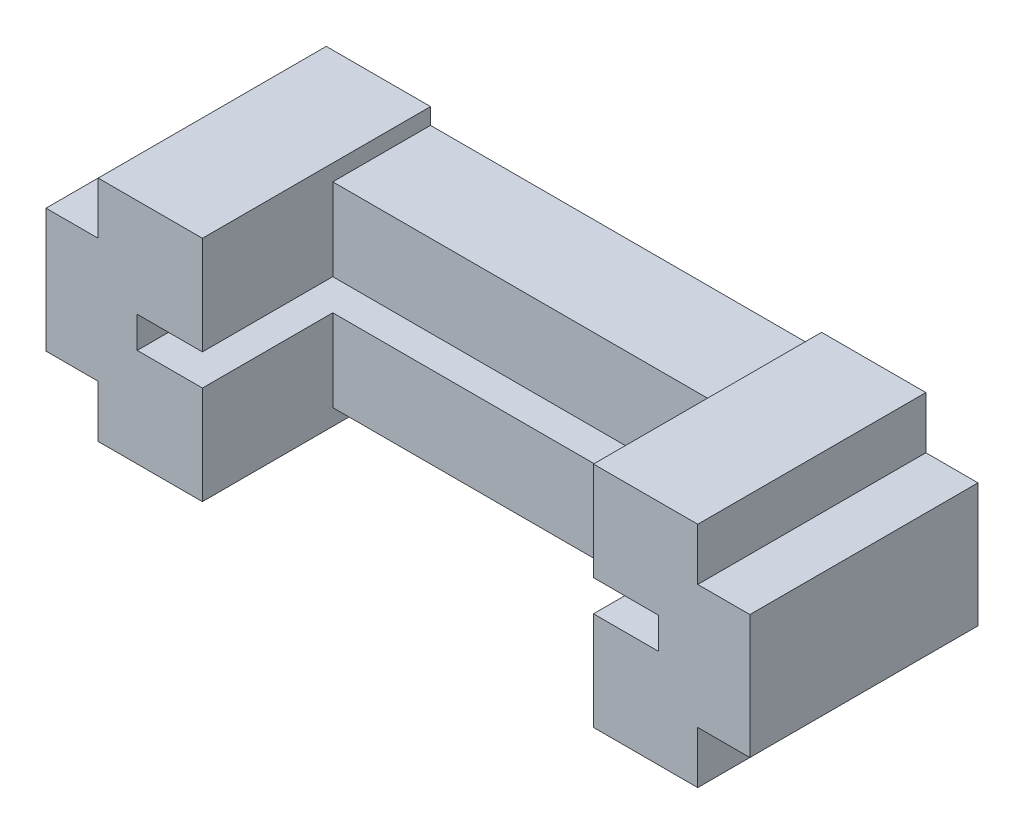
ISO-10303-21;
HEADER;
FILE_DESCRIPTION(('STEP AP214'),'2;1');
FILE_NAME('part.step','',(''),(''),'','','');
FILE_SCHEMA(('AUTOMOTIVE_DESIGN { 1 0 10303 214 1 1 1 1 }'));
ENDSEC;
DATA;
#1=APPLICATION_CONTEXT('core data for automotive mechanical design processes');
#2=APPLICATION_PROTOCOL_DEFINITION('international standard','automotive_design',2000,#1);
#3=PRODUCT_CONTEXT('',#1,'mechanical');
#4=PRODUCT('Part','Part','',(#3));
#5=PRODUCT_RELATED_PRODUCT_CATEGORY('part','',(#4));
#6=PRODUCT_DEFINITION_FORMATION('','',#4);
#7=PRODUCT_DEFINITION_CONTEXT('part definition',#1,'design');
#8=PRODUCT_DEFINITION('design','',#6,#7);
#9=PRODUCT_DEFINITION_SHAPE('','',#8);
#10=(LENGTH_UNIT() NAMED_UNIT(*) SI_UNIT(.MILLI.,.METRE.));
#11=(NAMED_UNIT(*) PLANE_ANGLE_UNIT() SI_UNIT($,.RADIAN.));
#12=(NAMED_UNIT(*) SI_UNIT($,.STERADIAN.) SOLID_ANGLE_UNIT());
#13=UNCERTAINTY_MEASURE_WITH_UNIT(LENGTH_MEASURE(1.E-05),#10,'distance_accuracy_value','');
#14=(GEOMETRIC_REPRESENTATION_CONTEXT(3) GLOBAL_UNCERTAINTY_ASSIGNED_CONTEXT((#13)) GLOBAL_UNIT_ASSIGNED_CONTEXT((#10,
#11,#12)) REPRESENTATION_CONTEXT('',''));
#15=CARTESIAN_POINT('',(0.,0.,0.));
#16=DIRECTION('',(0.,0.,1.));
#17=DIRECTION('',(1.,0.,0.));
#18=AXIS2_PLACEMENT_3D('',#15,#16,#17);
#19=CARTESIAN_POINT('',(-29.21,-11.1125,9.525));
#20=DIRECTION('',(0.,1.,0.));
#21=DIRECTION('',(-1.,0.,0.));
#22=AXIS2_PLACEMENT_3D('',#19,#20,#21);
#23=PLANE('',#22);
#24=DIRECTION('',(1.,0.,0.));
#25=VECTOR('',#24,1.);
#26=CARTESIAN_POINT('',(-29.21,-11.1125,0.));
#27=LINE('',#26,#25);
#28=CARTESIAN_POINT('',(-29.21,-11.1125,0.));
#29=VERTEX_POINT('',#28);
#30=CARTESIAN_POINT('',(-19.05,-11.1125,0.));
#31=VERTEX_POINT('',#30);
#32=EDGE_CURVE('E387',#29,#31,#27,.T.);
#33=ORIENTED_EDGE('',*,*,#32,.T.);
#34=DIRECTION('',(0.,0.,-1.));
#35=VECTOR('',#34,1.);
#36=CARTESIAN_POINT('',(-19.05,-11.1125,22.225));
#37=LINE('',#36,#35);
#38=CARTESIAN_POINT('',(-19.05,-11.1125,22.225));
#39=VERTEX_POINT('',#38);
#40=EDGE_CURVE('E360',#39,#31,#37,.T.);
#41=ORIENTED_EDGE('',*,*,#40,.F.);
#42=DIRECTION('',(1.,0.,0.));
#43=VECTOR('',#42,1.);
#44=CARTESIAN_POINT('',(-29.21,-11.1125,22.225));
#45=LINE('',#44,#43);
#46=CARTESIAN_POINT('',(-29.21,-11.1125,22.225));
#47=VERTEX_POINT('',#46);
#48=EDGE_CURVE('E358',#47,#39,#45,.T.);
#49=ORIENTED_EDGE('',*,*,#48,.F.);
#50=DIRECTION('',(0.,0.,-1.));
#51=VECTOR('',#50,1.);
#52=CARTESIAN_POINT('',(-29.21,-11.1125,9.525));
#53=LINE('',#52,#51);
#54=EDGE_CURVE('E424',#47,#29,#53,.T.);
#55=ORIENTED_EDGE('',*,*,#54,.T.);
#56=EDGE_LOOP('',(#33,#41,#49,#55));
#57=FACE_BOUND('',#56,.T.);
#58=ADVANCED_FACE('F35',(#57),#23,.F.);
#59=CARTESIAN_POINT('',(-29.21,11.1125,9.525));
#60=DIRECTION('',(0.,-1.,0.));
#61=DIRECTION('',(1.,0.,0.));
#62=AXIS2_PLACEMENT_3D('',#59,#60,#61);
#63=PLANE('',#62);
#64=DIRECTION('',(0.,0.,-1.));
#65=VECTOR('',#64,1.);
#66=CARTESIAN_POINT('',(-19.05,11.1125,22.225));
#67=LINE('',#66,#65);
#68=CARTESIAN_POINT('',(-19.05,11.1125,22.225));
#69=VERTEX_POINT('',#68);
#70=CARTESIAN_POINT('',(-19.05,11.1125,0.));
#71=VERTEX_POINT('',#70);
#72=EDGE_CURVE('E364',#69,#71,#67,.T.);
#73=ORIENTED_EDGE('',*,*,#72,.T.);
#74=DIRECTION('',(-1.,0.,0.));
#75=VECTOR('',#74,1.);
#76=CARTESIAN_POINT('',(-29.21,11.1125,0.));
#77=LINE('',#76,#75);
#78=CARTESIAN_POINT('',(-29.21,11.1125,0.));
#79=VERTEX_POINT('',#78);
#80=EDGE_CURVE('E242',#71,#79,#77,.T.);
#81=ORIENTED_EDGE('',*,*,#80,.T.);
#82=DIRECTION('',(0.,0.,-1.));
#83=VECTOR('',#82,1.);
#84=CARTESIAN_POINT('',(-29.21,11.1125,9.525));
#85=LINE('',#84,#83);
#86=CARTESIAN_POINT('',(-29.21,11.1125,22.225));
#87=VERTEX_POINT('',#86);
#88=EDGE_CURVE('E403',#87,#79,#85,.T.);
#89=ORIENTED_EDGE('',*,*,#88,.F.);
#90=DIRECTION('',(-1.,0.,0.));
#91=VECTOR('',#90,1.);
#92=CARTESIAN_POINT('',(-29.21,11.1125,22.225));
#93=LINE('',#92,#91);
#94=EDGE_CURVE('E340',#69,#87,#93,.T.);
#95=ORIENTED_EDGE('',*,*,#94,.F.);
#96=EDGE_LOOP('',(#73,#81,#89,#95));
#97=FACE_BOUND('',#96,.T.);
#98=ADVANCED_FACE('F476',(#97),#63,.F.);
#99=CARTESIAN_POINT('',(0.,0.,9.525));
#100=DIRECTION('',(0.,0.,1.));
#101=DIRECTION('',(1.,0.,0.));
#102=AXIS2_PLACEMENT_3D('',#99,#100,#101);
#103=PLANE('',#102);
#104=DIRECTION('',(1.,0.,0.));
#105=VECTOR('',#104,1.);
#106=CARTESIAN_POINT('',(0.,9.525,9.525));
#107=LINE('',#106,#105);
#108=CARTESIAN_POINT('',(-19.05,9.525,9.525));
#109=VERTEX_POINT('',#108);
#110=CARTESIAN_POINT('',(19.05,9.525,9.525));
#111=VERTEX_POINT('',#110);
#112=EDGE_CURVE('E250',#109,#111,#107,.T.);
#113=ORIENTED_EDGE('',*,*,#112,.F.);
#114=DIRECTION('',(0.,1.,0.));
#115=VECTOR('',#114,1.);
#116=CARTESIAN_POINT('',(-19.05,11.1125,9.525));
#117=LINE('',#116,#115);
#118=CARTESIAN_POINT('',(-19.05,1.524,9.525));
#119=VERTEX_POINT('',#118);
#120=EDGE_CURVE('E230',#119,#109,#117,.T.);
#121=ORIENTED_EDGE('',*,*,#120,.F.);
#122=DIRECTION('',(-1.,0.,0.));
#123=VECTOR('',#122,1.);
#124=CARTESIAN_POINT('',(-25.4,1.524,9.525));
#125=LINE('',#124,#123);
#126=CARTESIAN_POINT('',(19.05,1.524,9.525));
#127=VERTEX_POINT('',#126);
#128=EDGE_CURVE('E268',#127,#119,#125,.T.);
#129=ORIENTED_EDGE('',*,*,#128,.F.);
#130=DIRECTION('',(0.,-1.,0.));
#131=VECTOR('',#130,1.);
#132=CARTESIAN_POINT('',(19.05,11.1125,9.525));
#133=LINE('',#132,#131);
#134=EDGE_CURVE('E284',#111,#127,#133,.T.);
#135=ORIENTED_EDGE('',*,*,#134,.F.);
#136=EDGE_LOOP('',(#113,#121,#129,#135));
#137=FACE_BOUND('',#136,.T.);
#138=ADVANCED_FACE('F493',(#137),#103,.T.);
#139=DIRECTION('',(-1.,0.,0.));
#140=VECTOR('',#139,1.);
#141=CARTESIAN_POINT('',(0.,-9.525,9.525));
#142=LINE('',#141,#140);
#143=CARTESIAN_POINT('',(19.05,-9.525,9.525));
#144=VERTEX_POINT('',#143);
#145=CARTESIAN_POINT('',(-19.05,-9.525,9.525));
#146=VERTEX_POINT('',#145);
#147=EDGE_CURVE('E261',#144,#146,#142,.T.);
#148=ORIENTED_EDGE('',*,*,#147,.F.);
#149=DIRECTION('',(0.,-1.,0.));
#150=VECTOR('',#149,1.);
#151=CARTESIAN_POINT('',(19.05,-1.524,9.525));
#152=LINE('',#151,#150);
#153=CARTESIAN_POINT('',(19.05,-1.524,9.525));
#154=VERTEX_POINT('',#153);
#155=EDGE_CURVE('E277',#154,#144,#152,.T.);
#156=ORIENTED_EDGE('',*,*,#155,.F.);
#157=DIRECTION('',(1.,0.,0.));
#158=VECTOR('',#157,1.);
#159=CARTESIAN_POINT('',(-25.4,-1.524,9.525));
#160=LINE('',#159,#158);
#161=CARTESIAN_POINT('',(-19.05,-1.524,9.525));
#162=VERTEX_POINT('',#161);
#163=EDGE_CURVE('E263',#162,#154,#160,.T.);
#164=ORIENTED_EDGE('',*,*,#163,.F.);
#165=DIRECTION('',(0.,1.,0.));
#166=VECTOR('',#165,1.);
#167=CARTESIAN_POINT('',(-19.05,-1.524,9.525));
#168=LINE('',#167,#166);
#169=EDGE_CURVE('E329',#146,#162,#168,.T.);
#170=ORIENTED_EDGE('',*,*,#169,.F.);
#171=EDGE_LOOP('',(#148,#156,#164,#170));
#172=FACE_BOUND('',#171,.T.);
#173=ADVANCED_FACE('F486',(#172),#103,.T.);
#174=CARTESIAN_POINT('',(-29.21,11.1125,9.525));
#175=DIRECTION('',(1.,0.,0.));
#176=DIRECTION('',(0.,0.,-1.));
#177=AXIS2_PLACEMENT_3D('',#174,#175,#176);
#178=PLANE('',#177);
#179=DIRECTION('',(0.,-1.,0.));
#180=VECTOR('',#179,1.);
#181=CARTESIAN_POINT('',(-29.21,11.1125,0.));
#182=LINE('',#181,#180);
#183=CARTESIAN_POINT('',(-29.21,6.0325,0.));
#184=VERTEX_POINT('',#183);
#185=EDGE_CURVE('E375',#79,#184,#182,.T.);
#186=ORIENTED_EDGE('',*,*,#185,.T.);
#187=DIRECTION('',(0.,0.,-1.));
#188=VECTOR('',#187,1.);
#189=CARTESIAN_POINT('',(-29.21,6.0325,9.525));
#190=LINE('',#189,#188);
#191=CARTESIAN_POINT('',(-29.21,6.0325,22.225));
#192=VERTEX_POINT('',#191);
#193=EDGE_CURVE('E11',#192,#184,#190,.T.);
#194=ORIENTED_EDGE('',*,*,#193,.F.);
#195=DIRECTION('',(0.,-1.,0.));
#196=VECTOR('',#195,1.);
#197=CARTESIAN_POINT('',(-29.21,11.1125,22.225));
#198=LINE('',#197,#196);
#199=EDGE_CURVE('E343',#87,#192,#198,.T.);
#200=ORIENTED_EDGE('',*,*,#199,.F.);
#201=ORIENTED_EDGE('',*,*,#88,.T.);
#202=EDGE_LOOP('',(#186,#194,#200,#201));
#203=FACE_BOUND('',#202,.T.);
#204=ADVANCED_FACE('F37',(#203),#178,.F.);
#205=CARTESIAN_POINT('',(-34.29,6.0325,9.525));
#206=DIRECTION('',(0.,-1.,0.));
#207=DIRECTION('',(0.,0.,-1.));
#208=AXIS2_PLACEMENT_3D('',#205,#206,#207);
#209=PLANE('',#208);
#210=DIRECTION('',(-1.,0.,0.));
#211=VECTOR('',#210,1.);
#212=CARTESIAN_POINT('',(-34.29,6.0325,0.));
#213=LINE('',#212,#211);
#214=CARTESIAN_POINT('',(-34.29,6.0325,0.));
#215=VERTEX_POINT('',#214);
#216=EDGE_CURVE('E378',#184,#215,#213,.T.);
#217=ORIENTED_EDGE('',*,*,#216,.T.);
#218=DIRECTION('',(0.,0.,-1.));
#219=VECTOR('',#218,1.);
#220=CARTESIAN_POINT('',(-34.29,6.0325,9.525));
#221=LINE('',#220,#219);
#222=CARTESIAN_POINT('',(-34.29,6.0325,22.225));
#223=VERTEX_POINT('',#222);
#224=EDGE_CURVE('E43',#223,#215,#221,.T.);
#225=ORIENTED_EDGE('',*,*,#224,.F.);
#226=DIRECTION('',(-1.,0.,0.));
#227=VECTOR('',#226,1.);
#228=CARTESIAN_POINT('',(-34.29,6.0325,22.225));
#229=LINE('',#228,#227);
#230=EDGE_CURVE('E346',#192,#223,#229,.T.);
#231=ORIENTED_EDGE('',*,*,#230,.F.);
#232=ORIENTED_EDGE('',*,*,#193,.T.);
#233=EDGE_LOOP('',(#217,#225,#231,#232));
#234=FACE_BOUND('',#233,.T.);
#235=ADVANCED_FACE('F479',(#234),#209,.F.);
#236=CARTESIAN_POINT('',(-34.29,-6.0325,9.525));
#237=DIRECTION('',(1.,0.,0.));
#238=DIRECTION('',(0.,1.,0.));
#239=AXIS2_PLACEMENT_3D('',#236,#237,#238);
#240=PLANE('',#239);
#241=DIRECTION('',(0.,-1.,0.));
#242=VECTOR('',#241,1.);
#243=CARTESIAN_POINT('',(-34.29,-6.0325,0.));
#244=LINE('',#243,#242);
#245=CARTESIAN_POINT('',(-34.29,-6.0325,0.));
#246=VERTEX_POINT('',#245);
#247=EDGE_CURVE('E380',#215,#246,#244,.T.);
#248=ORIENTED_EDGE('',*,*,#247,.T.);
#249=DIRECTION('',(0.,0.,-1.));
#250=VECTOR('',#249,1.);
#251=CARTESIAN_POINT('',(-34.29,-6.0325,9.525));
#252=LINE('',#251,#250);
#253=CARTESIAN_POINT('',(-34.29,-6.0325,22.225));
#254=VERTEX_POINT('',#253);
#255=EDGE_CURVE('E430',#254,#246,#252,.T.);
#256=ORIENTED_EDGE('',*,*,#255,.F.);
#257=DIRECTION('',(0.,-1.,0.));
#258=VECTOR('',#257,1.);
#259=CARTESIAN_POINT('',(-34.29,6.0325,22.225));
#260=LINE('',#259,#258);
#261=EDGE_CURVE('E349',#223,#254,#260,.T.);
#262=ORIENTED_EDGE('',*,*,#261,.F.);
#263=ORIENTED_EDGE('',*,*,#224,.T.);
#264=EDGE_LOOP('',(#248,#256,#262,#263));
#265=FACE_BOUND('',#264,.T.);
#266=ADVANCED_FACE('F436',(#265),#240,.F.);
#267=CARTESIAN_POINT('',(-34.29,-6.0325,9.525));
#268=DIRECTION('',(0.,1.,0.));
#269=DIRECTION('',(0.,0.,1.));
#270=AXIS2_PLACEMENT_3D('',#267,#268,#269);
#271=PLANE('',#270);
#272=DIRECTION('',(1.,0.,0.));
#273=VECTOR('',#272,1.);
#274=CARTESIAN_POINT('',(-34.29,-6.0325,0.));
#275=LINE('',#274,#273);
#276=CARTESIAN_POINT('',(-29.21,-6.0325,0.));
#277=VERTEX_POINT('',#276);
#278=EDGE_CURVE('E382',#246,#277,#275,.T.);
#279=ORIENTED_EDGE('',*,*,#278,.T.);
#280=DIRECTION('',(0.,0.,-1.));
#281=VECTOR('',#280,1.);
#282=CARTESIAN_POINT('',(-29.21,-6.0325,9.525));
#283=LINE('',#282,#281);
#284=CARTESIAN_POINT('',(-29.21,-6.0325,22.225));
#285=VERTEX_POINT('',#284);
#286=EDGE_CURVE('E427',#285,#277,#283,.T.);
#287=ORIENTED_EDGE('',*,*,#286,.F.);
#288=DIRECTION('',(1.,0.,0.));
#289=VECTOR('',#288,1.);
#290=CARTESIAN_POINT('',(-29.21,-6.0325,22.225));
#291=LINE('',#290,#289);
#292=EDGE_CURVE('E352',#254,#285,#291,.T.);
#293=ORIENTED_EDGE('',*,*,#292,.F.);
#294=ORIENTED_EDGE('',*,*,#255,.T.);
#295=EDGE_LOOP('',(#279,#287,#293,#294));
#296=FACE_BOUND('',#295,.T.);
#297=ADVANCED_FACE('F443',(#296),#271,.F.);
#298=CARTESIAN_POINT('',(-29.21,-11.1125,9.525));
#299=DIRECTION('',(1.,0.,0.));
#300=DIRECTION('',(0.,0.,-1.));
#301=AXIS2_PLACEMENT_3D('',#298,#299,#300);
#302=PLANE('',#301);
#303=DIRECTION('',(0.,-1.,0.));
#304=VECTOR('',#303,1.);
#305=CARTESIAN_POINT('',(-29.21,-11.1125,0.));
#306=LINE('',#305,#304);
#307=EDGE_CURVE('E384',#277,#29,#306,.T.);
#308=ORIENTED_EDGE('',*,*,#307,.T.);
#309=ORIENTED_EDGE('',*,*,#54,.F.);
#310=DIRECTION('',(0.,-1.,0.));
#311=VECTOR('',#310,1.);
#312=CARTESIAN_POINT('',(-29.21,-6.0325,22.225));
#313=LINE('',#312,#311);
#314=EDGE_CURVE('E355',#285,#47,#313,.T.);
#315=ORIENTED_EDGE('',*,*,#314,.F.);
#316=ORIENTED_EDGE('',*,*,#286,.T.);
#317=EDGE_LOOP('',(#308,#309,#315,#316));
#318=FACE_BOUND('',#317,.T.);
#319=ADVANCED_FACE('F447',(#318),#302,.F.);
#320=DIRECTION('',(0.,0.,-1.));
#321=VECTOR('',#320,1.);
#322=CARTESIAN_POINT('',(19.05,-11.1125,22.225));
#323=LINE('',#322,#321);
#324=CARTESIAN_POINT('',(19.05,-11.1125,22.225));
#325=VERTEX_POINT('',#324);
#326=CARTESIAN_POINT('',(19.05,-11.1125,0.));
#327=VERTEX_POINT('',#326);
#328=EDGE_CURVE('E324',#325,#327,#323,.T.);
#329=ORIENTED_EDGE('',*,*,#328,.T.);
#330=CARTESIAN_POINT('',(29.21,-11.1125,0.));
#331=VERTEX_POINT('',#330);
#332=EDGE_CURVE('E386',#327,#331,#27,.T.);
#333=ORIENTED_EDGE('',*,*,#332,.T.);
#334=DIRECTION('',(0.,0.,-1.));
#335=VECTOR('',#334,1.);
#336=CARTESIAN_POINT('',(29.21,-11.1125,9.525));
#337=LINE('',#336,#335);
#338=CARTESIAN_POINT('',(29.21,-11.1125,22.225));
#339=VERTEX_POINT('',#338);
#340=EDGE_CURVE('E421',#339,#331,#337,.T.);
#341=ORIENTED_EDGE('',*,*,#340,.F.);
#342=DIRECTION('',(1.,0.,0.));
#343=VECTOR('',#342,1.);
#344=CARTESIAN_POINT('',(29.21,-11.1125,22.225));
#345=LINE('',#344,#343);
#346=EDGE_CURVE('E286',#325,#339,#345,.T.);
#347=ORIENTED_EDGE('',*,*,#346,.F.);
#348=EDGE_LOOP('',(#329,#333,#341,#347));
#349=FACE_BOUND('',#348,.T.);
#350=ADVANCED_FACE('F489',(#349),#23,.F.);
#351=CARTESIAN_POINT('',(29.21,-11.1125,9.525));
#352=DIRECTION('',(-1.,0.,0.));
#353=DIRECTION('',(0.,0.,1.));
#354=AXIS2_PLACEMENT_3D('',#351,#352,#353);
#355=PLANE('',#354);
#356=DIRECTION('',(0.,1.,0.));
#357=VECTOR('',#356,1.);
#358=CARTESIAN_POINT('',(29.21,-11.1125,0.));
#359=LINE('',#358,#357);
#360=CARTESIAN_POINT('',(29.21,-6.0325,0.));
#361=VERTEX_POINT('',#360);
#362=EDGE_CURVE('E390',#331,#361,#359,.T.);
#363=ORIENTED_EDGE('',*,*,#362,.T.);
#364=DIRECTION('',(0.,0.,-1.));
#365=VECTOR('',#364,1.);
#366=CARTESIAN_POINT('',(29.21,-6.0325,9.525));
#367=LINE('',#366,#365);
#368=CARTESIAN_POINT('',(29.21,-6.0325,22.225));
#369=VERTEX_POINT('',#368);
#370=EDGE_CURVE('E418',#369,#361,#367,.T.);
#371=ORIENTED_EDGE('',*,*,#370,.F.);
#372=DIRECTION('',(0.,1.,0.));
#373=VECTOR('',#372,1.);
#374=CARTESIAN_POINT('',(29.21,-11.1125,22.225));
#375=LINE('',#374,#373);
#376=EDGE_CURVE('E289',#339,#369,#375,.T.);
#377=ORIENTED_EDGE('',*,*,#376,.F.);
#378=ORIENTED_EDGE('',*,*,#340,.T.);
#379=EDGE_LOOP('',(#363,#371,#377,#378));
#380=FACE_BOUND('',#379,.T.);
#381=ADVANCED_FACE('F499',(#380),#355,.F.);
#382=CARTESIAN_POINT('',(34.29,-6.0325,9.525));
#383=DIRECTION('',(0.,1.,0.));
#384=DIRECTION('',(0.,0.,1.));
#385=AXIS2_PLACEMENT_3D('',#382,#383,#384);
#386=PLANE('',#385);
#387=DIRECTION('',(1.,0.,0.));
#388=VECTOR('',#387,1.);
#389=CARTESIAN_POINT('',(34.29,-6.0325,0.));
#390=LINE('',#389,#388);
#391=CARTESIAN_POINT('',(34.29,-6.0325,0.));
#392=VERTEX_POINT('',#391);
#393=EDGE_CURVE('E392',#361,#392,#390,.T.);
#394=ORIENTED_EDGE('',*,*,#393,.T.);
#395=DIRECTION('',(0.,0.,-1.));
#396=VECTOR('',#395,1.);
#397=CARTESIAN_POINT('',(34.29,-6.0325,9.525));
#398=LINE('',#397,#396);
#399=CARTESIAN_POINT('',(34.29,-6.0325,22.225));
#400=VERTEX_POINT('',#399);
#401=EDGE_CURVE('E415',#400,#392,#398,.T.);
#402=ORIENTED_EDGE('',*,*,#401,.F.);
#403=DIRECTION('',(1.,0.,0.));
#404=VECTOR('',#403,1.);
#405=CARTESIAN_POINT('',(34.29,-6.0325,22.225));
#406=LINE('',#405,#404);
#407=EDGE_CURVE('E292',#369,#400,#406,.T.);
#408=ORIENTED_EDGE('',*,*,#407,.F.);
#409=ORIENTED_EDGE('',*,*,#370,.T.);
#410=EDGE_LOOP('',(#394,#402,#408,#409));
#411=FACE_BOUND('',#410,.T.);
#412=ADVANCED_FACE('F505',(#411),#386,.F.);
#413=CARTESIAN_POINT('',(34.29,-6.0325,9.525));
#414=DIRECTION('',(-1.,0.,0.));
#415=DIRECTION('',(0.,-1.,0.));
#416=AXIS2_PLACEMENT_3D('',#413,#414,#415);
#417=PLANE('',#416);
#418=DIRECTION('',(0.,1.,0.));
#419=VECTOR('',#418,1.);
#420=CARTESIAN_POINT('',(34.29,-6.0325,0.));
#421=LINE('',#420,#419);
#422=CARTESIAN_POINT('',(34.29,6.0325,0.));
#423=VERTEX_POINT('',#422);
#424=EDGE_CURVE('E394',#392,#423,#421,.T.);
#425=ORIENTED_EDGE('',*,*,#424,.T.);
#426=DIRECTION('',(0.,0.,-1.));
#427=VECTOR('',#426,1.);
#428=CARTESIAN_POINT('',(34.29,6.0325,9.525));
#429=LINE('',#428,#427);
#430=CARTESIAN_POINT('',(34.29,6.0325,22.225));
#431=VERTEX_POINT('',#430);
#432=EDGE_CURVE('E412',#431,#423,#429,.T.);
#433=ORIENTED_EDGE('',*,*,#432,.F.);
#434=DIRECTION('',(0.,1.,0.));
#435=VECTOR('',#434,1.);
#436=CARTESIAN_POINT('',(34.29,6.0325,22.225));
#437=LINE('',#436,#435);
#438=EDGE_CURVE('E295',#400,#431,#437,.T.);
#439=ORIENTED_EDGE('',*,*,#438,.F.);
#440=ORIENTED_EDGE('',*,*,#401,.T.);
#441=EDGE_LOOP('',(#425,#433,#439,#440));
#442=FACE_BOUND('',#441,.T.);
#443=ADVANCED_FACE('F524',(#442),#417,.F.);
#444=CARTESIAN_POINT('',(34.29,6.0325,9.525));
#445=DIRECTION('',(0.,-1.,0.));
#446=DIRECTION('',(0.,0.,-1.));
#447=AXIS2_PLACEMENT_3D('',#444,#445,#446);
#448=PLANE('',#447);
#449=DIRECTION('',(-1.,0.,0.));
#450=VECTOR('',#449,1.);
#451=CARTESIAN_POINT('',(34.29,6.0325,0.));
#452=LINE('',#451,#450);
#453=CARTESIAN_POINT('',(29.21,6.0325,0.));
#454=VERTEX_POINT('',#453);
#455=EDGE_CURVE('E396',#423,#454,#452,.T.);
#456=ORIENTED_EDGE('',*,*,#455,.T.);
#457=DIRECTION('',(0.,0.,-1.));
#458=VECTOR('',#457,1.);
#459=CARTESIAN_POINT('',(29.21,6.0325,9.525));
#460=LINE('',#459,#458);
#461=CARTESIAN_POINT('',(29.21,6.0325,22.225));
#462=VERTEX_POINT('',#461);
#463=EDGE_CURVE('E409',#462,#454,#460,.T.);
#464=ORIENTED_EDGE('',*,*,#463,.F.);
#465=DIRECTION('',(-1.,0.,0.));
#466=VECTOR('',#465,1.);
#467=CARTESIAN_POINT('',(34.29,6.0325,22.225));
#468=LINE('',#467,#466);
#469=EDGE_CURVE('E298',#431,#462,#468,.T.);
#470=ORIENTED_EDGE('',*,*,#469,.F.);
#471=ORIENTED_EDGE('',*,*,#432,.T.);
#472=EDGE_LOOP('',(#456,#464,#470,#471));
#473=FACE_BOUND('',#472,.T.);
#474=ADVANCED_FACE('F527',(#473),#448,.F.);
#475=CARTESIAN_POINT('',(29.21,11.1125,9.525));
#476=DIRECTION('',(-1.,0.,0.));
#477=DIRECTION('',(0.,0.,1.));
#478=AXIS2_PLACEMENT_3D('',#475,#476,#477);
#479=PLANE('',#478);
#480=DIRECTION('',(0.,1.,0.));
#481=VECTOR('',#480,1.);
#482=CARTESIAN_POINT('',(29.21,11.1125,0.));
#483=LINE('',#482,#481);
#484=CARTESIAN_POINT('',(29.21,11.1125,0.));
#485=VERTEX_POINT('',#484);
#486=EDGE_CURVE('E398',#454,#485,#483,.T.);
#487=ORIENTED_EDGE('',*,*,#486,.T.);
#488=DIRECTION('',(0.,0.,-1.));
#489=VECTOR('',#488,1.);
#490=CARTESIAN_POINT('',(29.21,11.1125,9.525));
#491=LINE('',#490,#489);
#492=CARTESIAN_POINT('',(29.21,11.1125,22.225));
#493=VERTEX_POINT('',#492);
#494=EDGE_CURVE('E406',#493,#485,#491,.T.);
#495=ORIENTED_EDGE('',*,*,#494,.F.);
#496=DIRECTION('',(0.,1.,0.));
#497=VECTOR('',#496,1.);
#498=CARTESIAN_POINT('',(29.21,11.1125,22.225));
#499=LINE('',#498,#497);
#500=EDGE_CURVE('E301',#462,#493,#499,.T.);
#501=ORIENTED_EDGE('',*,*,#500,.F.);
#502=ORIENTED_EDGE('',*,*,#463,.T.);
#503=EDGE_LOOP('',(#487,#495,#501,#502));
#504=FACE_BOUND('',#503,.T.);
#505=ADVANCED_FACE('F531',(#504),#479,.F.);
#506=CARTESIAN_POINT('',(19.05,11.1125,0.));
#507=VERTEX_POINT('',#506);
#508=EDGE_CURVE('E400',#485,#507,#77,.T.);
#509=ORIENTED_EDGE('',*,*,#508,.T.);
#510=DIRECTION('',(0.,0.,-1.));
#511=VECTOR('',#510,1.);
#512=CARTESIAN_POINT('',(19.05,11.1125,22.225));
#513=LINE('',#512,#511);
#514=CARTESIAN_POINT('',(19.05,11.1125,22.225));
#515=VERTEX_POINT('',#514);
#516=EDGE_CURVE('E322',#515,#507,#513,.T.);
#517=ORIENTED_EDGE('',*,*,#516,.F.);
#518=DIRECTION('',(-1.,0.,0.));
#519=VECTOR('',#518,1.);
#520=CARTESIAN_POINT('',(29.21,11.1125,22.225));
#521=LINE('',#520,#519);
#522=EDGE_CURVE('E304',#493,#515,#521,.T.);
#523=ORIENTED_EDGE('',*,*,#522,.F.);
#524=ORIENTED_EDGE('',*,*,#494,.T.);
#525=EDGE_LOOP('',(#509,#517,#523,#524));
#526=FACE_BOUND('',#525,.T.);
#527=ADVANCED_FACE('F495',(#526),#63,.F.);
#528=CARTESIAN_POINT('',(0.,0.,0.));
#529=DIRECTION('',(0.,0.,1.));
#530=DIRECTION('',(1.,0.,0.));
#531=AXIS2_PLACEMENT_3D('',#528,#529,#530);
#532=PLANE('',#531);
#533=ORIENTED_EDGE('',*,*,#80,.F.);
#534=DIRECTION('',(0.,-1.,0.));
#535=VECTOR('',#534,1.);
#536=CARTESIAN_POINT('',(-19.05,11.1125,0.));
#537=LINE('',#536,#535);
#538=CARTESIAN_POINT('',(-19.05,9.525,0.));
#539=VERTEX_POINT('',#538);
#540=EDGE_CURVE('E226',#71,#539,#537,.T.);
#541=ORIENTED_EDGE('',*,*,#540,.T.);
#542=DIRECTION('',(1.,0.,0.));
#543=VECTOR('',#542,1.);
#544=CARTESIAN_POINT('',(-19.05,9.525,0.));
#545=LINE('',#544,#543);
#546=CARTESIAN_POINT('',(19.05,9.525,0.));
#547=VERTEX_POINT('',#546);
#548=EDGE_CURVE('E236',#539,#547,#545,.T.);
#549=ORIENTED_EDGE('',*,*,#548,.T.);
#550=DIRECTION('',(0.,1.,0.));
#551=VECTOR('',#550,1.);
#552=CARTESIAN_POINT('',(19.05,11.1125,0.));
#553=LINE('',#552,#551);
#554=EDGE_CURVE('E50',#547,#507,#553,.T.);
#555=ORIENTED_EDGE('',*,*,#554,.T.);
#556=ORIENTED_EDGE('',*,*,#508,.F.);
#557=ORIENTED_EDGE('',*,*,#486,.F.);
#558=ORIENTED_EDGE('',*,*,#455,.F.);
#559=ORIENTED_EDGE('',*,*,#424,.F.);
#560=ORIENTED_EDGE('',*,*,#393,.F.);
#561=ORIENTED_EDGE('',*,*,#362,.F.);
#562=ORIENTED_EDGE('',*,*,#332,.F.);
#563=DIRECTION('',(0.,1.,0.));
#564=VECTOR('',#563,1.);
#565=CARTESIAN_POINT('',(19.05,-11.1125,0.));
#566=LINE('',#565,#564);
#567=CARTESIAN_POINT('',(19.05,-9.525,0.));
#568=VERTEX_POINT('',#567);
#569=EDGE_CURVE('E252',#327,#568,#566,.T.);
#570=ORIENTED_EDGE('',*,*,#569,.T.);
#571=DIRECTION('',(-1.,0.,0.));
#572=VECTOR('',#571,1.);
#573=CARTESIAN_POINT('',(-19.05,-9.525,0.));
#574=LINE('',#573,#572);
#575=CARTESIAN_POINT('',(-19.05,-9.525,0.));
#576=VERTEX_POINT('',#575);
#577=EDGE_CURVE('E58',#568,#576,#574,.T.);
#578=ORIENTED_EDGE('',*,*,#577,.T.);
#579=DIRECTION('',(0.,-1.,0.));
#580=VECTOR('',#579,1.);
#581=CARTESIAN_POINT('',(-19.05,-11.1125,0.));
#582=LINE('',#581,#580);
#583=EDGE_CURVE('E256',#576,#31,#582,.T.);
#584=ORIENTED_EDGE('',*,*,#583,.T.);
#585=ORIENTED_EDGE('',*,*,#32,.F.);
#586=ORIENTED_EDGE('',*,*,#307,.F.);
#587=ORIENTED_EDGE('',*,*,#278,.F.);
#588=ORIENTED_EDGE('',*,*,#247,.F.);
#589=ORIENTED_EDGE('',*,*,#216,.F.);
#590=ORIENTED_EDGE('',*,*,#185,.F.);
#591=EDGE_LOOP('',(#533,#541,#549,#555,#556,#557,#558,#559,#560,#561,#562,#570,#578,#584,#585,
#586,#587,#588,#589,#590));
#592=FACE_BOUND('',#591,.T.);
#593=ADVANCED_FACE('F240',(#592),#532,.F.);
#594=CARTESIAN_POINT('',(-19.05,-1.524,22.225));
#595=DIRECTION('',(-1.,0.,0.));
#596=DIRECTION('',(0.,-1.,0.));
#597=AXIS2_PLACEMENT_3D('',#594,#595,#596);
#598=PLANE('',#597);
#599=DIRECTION('',(0.,0.,-1.));
#600=VECTOR('',#599,1.);
#601=CARTESIAN_POINT('',(-19.05,-1.524,22.225));
#602=LINE('',#601,#600);
#603=CARTESIAN_POINT('',(-19.05,-1.524,22.225));
#604=VERTEX_POINT('',#603);
#605=EDGE_CURVE('E372',#604,#162,#602,.T.);
#606=ORIENTED_EDGE('',*,*,#605,.F.);
#607=DIRECTION('',(0.,1.,0.));
#608=VECTOR('',#607,1.);
#609=CARTESIAN_POINT('',(-19.05,-1.524,22.225));
#610=LINE('',#609,#608);
#611=EDGE_CURVE('E330',#39,#604,#610,.T.);
#612=ORIENTED_EDGE('',*,*,#611,.F.);
#613=ORIENTED_EDGE('',*,*,#40,.T.);
#614=ORIENTED_EDGE('',*,*,#583,.F.);
#615=DIRECTION('',(0.,0.,1.));
#616=VECTOR('',#615,1.);
#617=CARTESIAN_POINT('',(-19.05,-9.525,0.));
#618=LINE('',#617,#616);
#619=EDGE_CURVE('E243',#576,#146,#618,.T.);
#620=ORIENTED_EDGE('',*,*,#619,.T.);
#621=ORIENTED_EDGE('',*,*,#169,.T.);
#622=EDGE_LOOP('',(#606,#612,#613,#614,#620,#621));
#623=FACE_BOUND('',#622,.T.);
#624=ADVANCED_FACE('F457',(#623),#598,.F.);
#625=CARTESIAN_POINT('',(-19.05,-1.524,22.225));
#626=DIRECTION('',(0.,-1.,0.));
#627=DIRECTION('',(1.,0.,0.));
#628=AXIS2_PLACEMENT_3D('',#625,#626,#627);
#629=PLANE('',#628);
#630=ORIENTED_EDGE('',*,*,#605,.T.);
#631=ORIENTED_EDGE('',*,*,#163,.T.);
#632=DIRECTION('',(0.,0.,-1.));
#633=VECTOR('',#632,1.);
#634=CARTESIAN_POINT('',(19.05,-1.524,22.225));
#635=LINE('',#634,#633);
#636=CARTESIAN_POINT('',(19.05,-1.524,22.225));
#637=VERTEX_POINT('',#636);
#638=EDGE_CURVE('E326',#637,#154,#635,.T.);
#639=ORIENTED_EDGE('',*,*,#638,.F.);
#640=DIRECTION('',(-1.,0.,0.));
#641=VECTOR('',#640,1.);
#642=CARTESIAN_POINT('',(19.05,-1.524,22.225));
#643=LINE('',#642,#641);
#644=CARTESIAN_POINT('',(25.4,-1.524,22.225));
#645=VERTEX_POINT('',#644);
#646=EDGE_CURVE('E280',#645,#637,#643,.T.);
#647=ORIENTED_EDGE('',*,*,#646,.F.);
#648=DIRECTION('',(0.,0.,-1.));
#649=VECTOR('',#648,1.);
#650=CARTESIAN_POINT('',(25.4,-1.524,22.225));
#651=LINE('',#650,#649);
#652=CARTESIAN_POINT('',(25.4,-1.524,3.429));
#653=VERTEX_POINT('',#652);
#654=EDGE_CURVE('E312',#645,#653,#651,.T.);
#655=ORIENTED_EDGE('',*,*,#654,.T.);
#656=DIRECTION('',(1.,0.,0.));
#657=VECTOR('',#656,1.);
#658=CARTESIAN_POINT('',(-25.4,-1.524,3.429));
#659=LINE('',#658,#657);
#660=CARTESIAN_POINT('',(-25.4,-1.524,3.429));
#661=VERTEX_POINT('',#660);
#662=EDGE_CURVE('E267',#661,#653,#659,.T.);
#663=ORIENTED_EDGE('',*,*,#662,.F.);
#664=DIRECTION('',(0.,0.,-1.));
#665=VECTOR('',#664,1.);
#666=CARTESIAN_POINT('',(-25.4,-1.524,22.225));
#667=LINE('',#666,#665);
#668=CARTESIAN_POINT('',(-25.4,-1.524,22.225));
#669=VERTEX_POINT('',#668);
#670=EDGE_CURVE('E370',#669,#661,#667,.T.);
#671=ORIENTED_EDGE('',*,*,#670,.F.);
#672=DIRECTION('',(-1.,0.,0.));
#673=VECTOR('',#672,1.);
#674=CARTESIAN_POINT('',(-19.05,-1.524,22.225));
#675=LINE('',#674,#673);
#676=EDGE_CURVE('E332',#604,#669,#675,.T.);
#677=ORIENTED_EDGE('',*,*,#676,.F.);
#678=EDGE_LOOP('',(#630,#631,#639,#647,#655,#663,#671,#677));
#679=FACE_BOUND('',#678,.T.);
#680=ADVANCED_FACE('F461',(#679),#629,.F.);
#681=CARTESIAN_POINT('',(-25.4,1.524,22.225));
#682=DIRECTION('',(-1.,0.,0.));
#683=DIRECTION('',(0.,0.,1.));
#684=AXIS2_PLACEMENT_3D('',#681,#682,#683);
#685=PLANE('',#684);
#686=ORIENTED_EDGE('',*,*,#670,.T.);
#687=DIRECTION('',(0.,-1.,0.));
#688=VECTOR('',#687,1.);
#689=CARTESIAN_POINT('',(-25.4,-1.524,3.429));
#690=LINE('',#689,#688);
#691=CARTESIAN_POINT('',(-25.4,1.524,3.429));
#692=VERTEX_POINT('',#691);
#693=EDGE_CURVE('E264',#692,#661,#690,.T.);
#694=ORIENTED_EDGE('',*,*,#693,.F.);
#695=DIRECTION('',(0.,0.,-1.));
#696=VECTOR('',#695,1.);
#697=CARTESIAN_POINT('',(-25.4,1.524,22.225));
#698=LINE('',#697,#696);
#699=CARTESIAN_POINT('',(-25.4,1.524,22.225));
#700=VERTEX_POINT('',#699);
#701=EDGE_CURVE('E368',#700,#692,#698,.T.);
#702=ORIENTED_EDGE('',*,*,#701,.F.);
#703=DIRECTION('',(0.,1.,0.));
#704=VECTOR('',#703,1.);
#705=CARTESIAN_POINT('',(-25.4,1.524,22.225));
#706=LINE('',#705,#704);
#707=EDGE_CURVE('E334',#669,#700,#706,.T.);
#708=ORIENTED_EDGE('',*,*,#707,.F.);
#709=EDGE_LOOP('',(#686,#694,#702,#708));
#710=FACE_BOUND('',#709,.T.);
#711=ADVANCED_FACE('F467',(#710),#685,.F.);
#712=CARTESIAN_POINT('',(-19.05,1.524,22.225));
#713=DIRECTION('',(0.,1.,0.));
#714=DIRECTION('',(-1.,0.,0.));
#715=AXIS2_PLACEMENT_3D('',#712,#713,#714);
#716=PLANE('',#715);
#717=ORIENTED_EDGE('',*,*,#701,.T.);
#718=DIRECTION('',(-1.,0.,0.));
#719=VECTOR('',#718,1.);
#720=CARTESIAN_POINT('',(-25.4,1.524,3.429));
#721=LINE('',#720,#719);
#722=CARTESIAN_POINT('',(25.4,1.524,3.429));
#723=VERTEX_POINT('',#722);
#724=EDGE_CURVE('E274',#723,#692,#721,.T.);
#725=ORIENTED_EDGE('',*,*,#724,.F.);
#726=DIRECTION('',(0.,0.,-1.));
#727=VECTOR('',#726,1.);
#728=CARTESIAN_POINT('',(25.4,1.524,22.225));
#729=LINE('',#728,#727);
#730=CARTESIAN_POINT('',(25.4,1.524,22.225));
#731=VERTEX_POINT('',#730);
#732=EDGE_CURVE('E317',#731,#723,#729,.T.);
#733=ORIENTED_EDGE('',*,*,#732,.F.);
#734=DIRECTION('',(1.,0.,0.));
#735=VECTOR('',#734,1.);
#736=CARTESIAN_POINT('',(19.05,1.524,22.225));
#737=LINE('',#736,#735);
#738=CARTESIAN_POINT('',(19.05,1.524,22.225));
#739=VERTEX_POINT('',#738);
#740=EDGE_CURVE('E308',#739,#731,#737,.T.);
#741=ORIENTED_EDGE('',*,*,#740,.F.);
#742=DIRECTION('',(0.,0.,-1.));
#743=VECTOR('',#742,1.);
#744=CARTESIAN_POINT('',(19.05,1.524,22.225));
#745=LINE('',#744,#743);
#746=EDGE_CURVE('E319',#739,#127,#745,.T.);
#747=ORIENTED_EDGE('',*,*,#746,.T.);
#748=ORIENTED_EDGE('',*,*,#128,.T.);
#749=DIRECTION('',(0.,0.,-1.));
#750=VECTOR('',#749,1.);
#751=CARTESIAN_POINT('',(-19.05,1.524,22.225));
#752=LINE('',#751,#750);
#753=CARTESIAN_POINT('',(-19.05,1.524,22.225));
#754=VERTEX_POINT('',#753);
#755=EDGE_CURVE('E366',#754,#119,#752,.T.);
#756=ORIENTED_EDGE('',*,*,#755,.F.);
#757=DIRECTION('',(1.,0.,0.));
#758=VECTOR('',#757,1.);
#759=CARTESIAN_POINT('',(-19.05,1.524,22.225));
#760=LINE('',#759,#758);
#761=EDGE_CURVE('E336',#700,#754,#760,.T.);
#762=ORIENTED_EDGE('',*,*,#761,.F.);
#763=EDGE_LOOP('',(#717,#725,#733,#741,#747,#748,#756,#762));
#764=FACE_BOUND('',#763,.T.);
#765=ADVANCED_FACE('F472',(#764),#716,.F.);
#766=CARTESIAN_POINT('',(-19.05,11.1125,22.225));
#767=DIRECTION('',(-1.,0.,0.));
#768=DIRECTION('',(0.,-1.,0.));
#769=AXIS2_PLACEMENT_3D('',#766,#767,#768);
#770=PLANE('',#769);
#771=ORIENTED_EDGE('',*,*,#120,.T.);
#772=DIRECTION('',(0.,0.,1.));
#773=VECTOR('',#772,1.);
#774=CARTESIAN_POINT('',(-19.05,9.525,0.));
#775=LINE('',#774,#773);
#776=EDGE_CURVE('E221',#539,#109,#775,.T.);
#777=ORIENTED_EDGE('',*,*,#776,.F.);
#778=ORIENTED_EDGE('',*,*,#540,.F.);
#779=ORIENTED_EDGE('',*,*,#72,.F.);
#780=DIRECTION('',(0.,1.,0.));
#781=VECTOR('',#780,1.);
#782=CARTESIAN_POINT('',(-19.05,11.1125,22.225));
#783=LINE('',#782,#781);
#784=EDGE_CURVE('E338',#754,#69,#783,.T.);
#785=ORIENTED_EDGE('',*,*,#784,.F.);
#786=ORIENTED_EDGE('',*,*,#755,.T.);
#787=EDGE_LOOP('',(#771,#777,#778,#779,#785,#786));
#788=FACE_BOUND('',#787,.T.);
#789=ADVANCED_FACE('F223',(#788),#770,.F.);
#790=CARTESIAN_POINT('',(0.,0.,22.225));
#791=DIRECTION('',(0.,0.,1.));
#792=DIRECTION('',(1.,0.,0.));
#793=AXIS2_PLACEMENT_3D('',#790,#791,#792);
#794=PLANE('',#793);
#795=ORIENTED_EDGE('',*,*,#611,.T.);
#796=ORIENTED_EDGE('',*,*,#676,.T.);
#797=ORIENTED_EDGE('',*,*,#707,.T.);
#798=ORIENTED_EDGE('',*,*,#761,.T.);
#799=ORIENTED_EDGE('',*,*,#784,.T.);
#800=ORIENTED_EDGE('',*,*,#94,.T.);
#801=ORIENTED_EDGE('',*,*,#199,.T.);
#802=ORIENTED_EDGE('',*,*,#230,.T.);
#803=ORIENTED_EDGE('',*,*,#261,.T.);
#804=ORIENTED_EDGE('',*,*,#292,.T.);
#805=ORIENTED_EDGE('',*,*,#314,.T.);
#806=ORIENTED_EDGE('',*,*,#48,.T.);
#807=EDGE_LOOP('',(#795,#796,#797,#798,#799,#800,#801,#802,#803,#804,#805,#806));
#808=FACE_BOUND('',#807,.T.);
#809=ADVANCED_FACE('F450',(#808),#794,.T.);
#810=CARTESIAN_POINT('',(19.05,-1.524,22.225));
#811=DIRECTION('',(1.,0.,0.));
#812=DIRECTION('',(0.,1.,0.));
#813=AXIS2_PLACEMENT_3D('',#810,#811,#812);
#814=PLANE('',#813);
#815=ORIENTED_EDGE('',*,*,#155,.T.);
#816=DIRECTION('',(0.,0.,1.));
#817=VECTOR('',#816,1.);
#818=CARTESIAN_POINT('',(19.05,-9.525,0.));
#819=LINE('',#818,#817);
#820=EDGE_CURVE('E246',#568,#144,#819,.T.);
#821=ORIENTED_EDGE('',*,*,#820,.F.);
#822=ORIENTED_EDGE('',*,*,#569,.F.);
#823=ORIENTED_EDGE('',*,*,#328,.F.);
#824=DIRECTION('',(0.,-1.,0.));
#825=VECTOR('',#824,1.);
#826=CARTESIAN_POINT('',(19.05,-1.524,22.225));
#827=LINE('',#826,#825);
#828=EDGE_CURVE('E283',#637,#325,#827,.T.);
#829=ORIENTED_EDGE('',*,*,#828,.F.);
#830=ORIENTED_EDGE('',*,*,#638,.T.);
#831=EDGE_LOOP('',(#815,#821,#822,#823,#829,#830));
#832=FACE_BOUND('',#831,.T.);
#833=ADVANCED_FACE('F512',(#832),#814,.F.);
#834=CARTESIAN_POINT('',(19.05,11.1125,22.225));
#835=DIRECTION('',(1.,0.,0.));
#836=DIRECTION('',(0.,1.,0.));
#837=AXIS2_PLACEMENT_3D('',#834,#835,#836);
#838=PLANE('',#837);
#839=ORIENTED_EDGE('',*,*,#746,.F.);
#840=DIRECTION('',(0.,-1.,0.));
#841=VECTOR('',#840,1.);
#842=CARTESIAN_POINT('',(19.05,11.1125,22.225));
#843=LINE('',#842,#841);
#844=EDGE_CURVE('E306',#515,#739,#843,.T.);
#845=ORIENTED_EDGE('',*,*,#844,.F.);
#846=ORIENTED_EDGE('',*,*,#516,.T.);
#847=ORIENTED_EDGE('',*,*,#554,.F.);
#848=DIRECTION('',(0.,0.,1.));
#849=VECTOR('',#848,1.);
#850=CARTESIAN_POINT('',(19.05,9.525,0.));
#851=LINE('',#850,#849);
#852=EDGE_CURVE('E233',#547,#111,#851,.T.);
#853=ORIENTED_EDGE('',*,*,#852,.T.);
#854=ORIENTED_EDGE('',*,*,#134,.T.);
#855=EDGE_LOOP('',(#839,#845,#846,#847,#853,#854));
#856=FACE_BOUND('',#855,.T.);
#857=ADVANCED_FACE('F540',(#856),#838,.F.);
#858=CARTESIAN_POINT('',(25.4,1.524,22.225));
#859=DIRECTION('',(1.,0.,0.));
#860=DIRECTION('',(0.,0.,-1.));
#861=AXIS2_PLACEMENT_3D('',#858,#859,#860);
#862=PLANE('',#861);
#863=ORIENTED_EDGE('',*,*,#732,.T.);
#864=DIRECTION('',(0.,1.,0.));
#865=VECTOR('',#864,1.);
#866=CARTESIAN_POINT('',(25.4,-1.524,3.429));
#867=LINE('',#866,#865);
#868=EDGE_CURVE('E271',#653,#723,#867,.T.);
#869=ORIENTED_EDGE('',*,*,#868,.F.);
#870=ORIENTED_EDGE('',*,*,#654,.F.);
#871=DIRECTION('',(0.,-1.,0.));
#872=VECTOR('',#871,1.);
#873=CARTESIAN_POINT('',(25.4,1.524,22.225));
#874=LINE('',#873,#872);
#875=EDGE_CURVE('E310',#731,#645,#874,.T.);
#876=ORIENTED_EDGE('',*,*,#875,.F.);
#877=EDGE_LOOP('',(#863,#869,#870,#876));
#878=FACE_BOUND('',#877,.T.);
#879=ADVANCED_FACE('F547',(#878),#862,.F.);
#880=CARTESIAN_POINT('',(0.,0.,22.225));
#881=DIRECTION('',(0.,0.,-1.));
#882=DIRECTION('',(-1.,0.,0.));
#883=AXIS2_PLACEMENT_3D('',#880,#881,#882);
#884=PLANE('',#883);
#885=ORIENTED_EDGE('',*,*,#646,.T.);
#886=ORIENTED_EDGE('',*,*,#828,.T.);
#887=ORIENTED_EDGE('',*,*,#346,.T.);
#888=ORIENTED_EDGE('',*,*,#376,.T.);
#889=ORIENTED_EDGE('',*,*,#407,.T.);
#890=ORIENTED_EDGE('',*,*,#438,.T.);
#891=ORIENTED_EDGE('',*,*,#469,.T.);
#892=ORIENTED_EDGE('',*,*,#500,.T.);
#893=ORIENTED_EDGE('',*,*,#522,.T.);
#894=ORIENTED_EDGE('',*,*,#844,.T.);
#895=ORIENTED_EDGE('',*,*,#740,.T.);
#896=ORIENTED_EDGE('',*,*,#875,.T.);
#897=EDGE_LOOP('',(#885,#886,#887,#888,#889,#890,#891,#892,#893,#894,#895,#896));
#898=FACE_BOUND('',#897,.T.);
#899=ADVANCED_FACE('F521',(#898),#884,.F.);
#900=CARTESIAN_POINT('',(0.,0.,3.429));
#901=DIRECTION('',(0.,0.,-1.));
#902=DIRECTION('',(-1.,0.,0.));
#903=AXIS2_PLACEMENT_3D('',#900,#901,#902);
#904=PLANE('',#903);
#905=ORIENTED_EDGE('',*,*,#693,.T.);
#906=ORIENTED_EDGE('',*,*,#662,.T.);
#907=ORIENTED_EDGE('',*,*,#868,.T.);
#908=ORIENTED_EDGE('',*,*,#724,.T.);
#909=EDGE_LOOP('',(#905,#906,#907,#908));
#910=FACE_BOUND('',#909,.T.);
#911=ADVANCED_FACE('F557',(#910),#904,.F.);
#912=CARTESIAN_POINT('',(-19.05,-9.525,0.));
#913=DIRECTION('',(0.,1.,0.));
#914=DIRECTION('',(0.,0.,1.));
#915=AXIS2_PLACEMENT_3D('',#912,#913,#914);
#916=PLANE('',#915);
#917=ORIENTED_EDGE('',*,*,#147,.T.);
#918=ORIENTED_EDGE('',*,*,#619,.F.);
#919=ORIENTED_EDGE('',*,*,#577,.F.);
#920=ORIENTED_EDGE('',*,*,#820,.T.);
#921=EDGE_LOOP('',(#917,#918,#919,#920));
#922=FACE_BOUND('',#921,.T.);
#923=ADVANCED_FACE('F555',(#922),#916,.F.);
#924=CARTESIAN_POINT('',(-19.05,9.525,0.));
#925=DIRECTION('',(0.,-1.,0.));
#926=DIRECTION('',(0.,0.,-1.));
#927=AXIS2_PLACEMENT_3D('',#924,#925,#926);
#928=PLANE('',#927);
#929=ORIENTED_EDGE('',*,*,#112,.T.);
#930=ORIENTED_EDGE('',*,*,#852,.F.);
#931=ORIENTED_EDGE('',*,*,#548,.F.);
#932=ORIENTED_EDGE('',*,*,#776,.T.);
#933=EDGE_LOOP('',(#929,#930,#931,#932));
#934=FACE_BOUND('',#933,.T.);
#935=ADVANCED_FACE('F237',(#934),#928,.F.);
#936=CLOSED_SHELL('',(#58,#98,#138,#173,#204,#235,#266,#297,#319,#350,#381,#412,#443,#474,#505,
#527,#593,#624,#680,#711,#765,#789,#809,#833,#857,#879,#899,#911,#923,#935));
#937=MANIFOLD_SOLID_BREP('B2',#936);
#938=ADVANCED_BREP_SHAPE_REPRESENTATION('',(#18,#937),#14);
#939=SHAPE_DEFINITION_REPRESENTATION(#9,#938);
ENDSEC;
END-ISO-10303-21;
